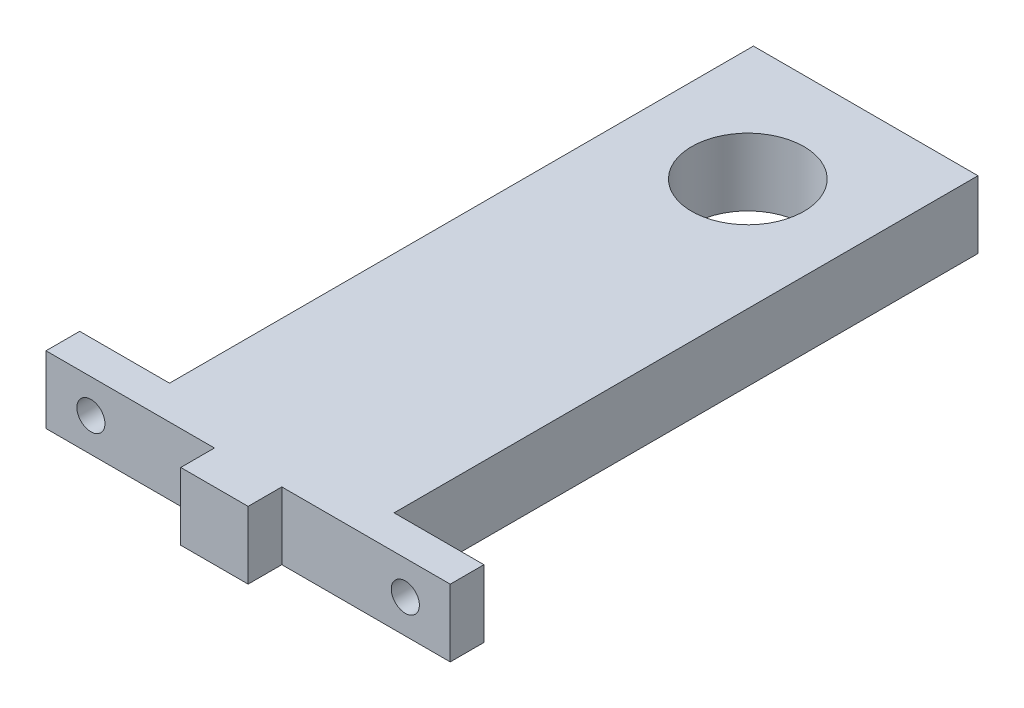
ISO-10303-21;
HEADER;
FILE_DESCRIPTION(('STEP AP214'),'2;1');
FILE_NAME('part.step','',(''),(''),'','','');
FILE_SCHEMA(('AUTOMOTIVE_DESIGN { 1 0 10303 214 1 1 1 1 }'));
ENDSEC;
DATA;
#1=APPLICATION_CONTEXT('core data for automotive mechanical design processes');
#2=APPLICATION_PROTOCOL_DEFINITION('international standard','automotive_design',2000,#1);
#3=PRODUCT_CONTEXT('',#1,'mechanical');
#4=PRODUCT('Part','Part','',(#3));
#5=PRODUCT_RELATED_PRODUCT_CATEGORY('part','',(#4));
#6=PRODUCT_DEFINITION_FORMATION('','',#4);
#7=PRODUCT_DEFINITION_CONTEXT('part definition',#1,'design');
#8=PRODUCT_DEFINITION('design','',#6,#7);
#9=PRODUCT_DEFINITION_SHAPE('','',#8);
#10=(LENGTH_UNIT() NAMED_UNIT(*) SI_UNIT(.MILLI.,.METRE.));
#11=(NAMED_UNIT(*) PLANE_ANGLE_UNIT() SI_UNIT($,.RADIAN.));
#12=(NAMED_UNIT(*) SI_UNIT($,.STERADIAN.) SOLID_ANGLE_UNIT());
#13=UNCERTAINTY_MEASURE_WITH_UNIT(LENGTH_MEASURE(1.E-05),#10,'distance_accuracy_value','');
#14=(GEOMETRIC_REPRESENTATION_CONTEXT(3) GLOBAL_UNCERTAINTY_ASSIGNED_CONTEXT((#13)) GLOBAL_UNIT_ASSIGNED_CONTEXT((#10,
#11,#12)) REPRESENTATION_CONTEXT('',''));
#15=CARTESIAN_POINT('',(0.,0.,0.));
#16=DIRECTION('',(0.,0.,1.));
#17=DIRECTION('',(1.,0.,0.));
#18=AXIS2_PLACEMENT_3D('',#15,#16,#17);
#19=CARTESIAN_POINT('',(10.,6.,-37.3687398107685));
#20=DIRECTION('',(-1.,0.,0.));
#21=DIRECTION('',(0.,0.,1.));
#22=AXIS2_PLACEMENT_3D('',#19,#20,#21);
#23=PLANE('',#22);
#24=DIRECTION('',(0.,0.,-1.));
#25=VECTOR('',#24,1.);
#26=CARTESIAN_POINT('',(10.,0.,-37.3687398107685));
#27=LINE('',#26,#25);
#28=CARTESIAN_POINT('',(10.,0.,14.6312601892315));
#29=VERTEX_POINT('',#28);
#30=CARTESIAN_POINT('',(10.,0.,-37.3687398107685));
#31=VERTEX_POINT('',#30);
#32=EDGE_CURVE('E160',#29,#31,#27,.T.);
#33=ORIENTED_EDGE('',*,*,#32,.T.);
#34=DIRECTION('',(0.,-1.,0.));
#35=VECTOR('',#34,1.);
#36=CARTESIAN_POINT('',(10.,6.,-37.3687398107685));
#37=LINE('',#36,#35);
#38=CARTESIAN_POINT('',(10.,6.,-37.3687398107685));
#39=VERTEX_POINT('',#38);
#40=EDGE_CURVE('E11',#39,#31,#37,.T.);
#41=ORIENTED_EDGE('',*,*,#40,.F.);
#42=DIRECTION('',(0.,0.,-1.));
#43=VECTOR('',#42,1.);
#44=CARTESIAN_POINT('',(10.,6.,-37.3687398107685));
#45=LINE('',#44,#43);
#46=CARTESIAN_POINT('',(10.,6.,14.6312601892315));
#47=VERTEX_POINT('',#46);
#48=EDGE_CURVE('E183',#47,#39,#45,.T.);
#49=ORIENTED_EDGE('',*,*,#48,.F.);
#50=DIRECTION('',(0.,-1.,0.));
#51=VECTOR('',#50,1.);
#52=CARTESIAN_POINT('',(10.,6.,14.6312601892315));
#53=LINE('',#52,#51);
#54=EDGE_CURVE('E156',#47,#29,#53,.T.);
#55=ORIENTED_EDGE('',*,*,#54,.T.);
#56=EDGE_LOOP('',(#33,#41,#49,#55));
#57=FACE_BOUND('',#56,.T.);
#58=ADVANCED_FACE('F38',(#57),#23,.F.);
#59=CARTESIAN_POINT('',(-10.,6.,-37.3687398107685));
#60=DIRECTION('',(0.,0.,1.));
#61=DIRECTION('',(1.,0.,0.));
#62=AXIS2_PLACEMENT_3D('',#59,#60,#61);
#63=PLANE('',#62);
#64=DIRECTION('',(-1.,0.,0.));
#65=VECTOR('',#64,1.);
#66=CARTESIAN_POINT('',(-10.,0.,-37.3687398107685));
#67=LINE('',#66,#65);
#68=CARTESIAN_POINT('',(-10.,0.,-37.3687398107685));
#69=VERTEX_POINT('',#68);
#70=EDGE_CURVE('E163',#31,#69,#67,.T.);
#71=ORIENTED_EDGE('',*,*,#70,.T.);
#72=DIRECTION('',(0.,-1.,0.));
#73=VECTOR('',#72,1.);
#74=CARTESIAN_POINT('',(-10.,6.,-37.3687398107685));
#75=LINE('',#74,#73);
#76=CARTESIAN_POINT('',(-10.,6.,-37.3687398107685));
#77=VERTEX_POINT('',#76);
#78=EDGE_CURVE('E47',#77,#69,#75,.T.);
#79=ORIENTED_EDGE('',*,*,#78,.F.);
#80=DIRECTION('',(-1.,0.,0.));
#81=VECTOR('',#80,1.);
#82=CARTESIAN_POINT('',(-10.,6.,-37.3687398107685));
#83=LINE('',#82,#81);
#84=EDGE_CURVE('E111',#39,#77,#83,.T.);
#85=ORIENTED_EDGE('',*,*,#84,.F.);
#86=ORIENTED_EDGE('',*,*,#40,.T.);
#87=EDGE_LOOP('',(#71,#79,#85,#86));
#88=FACE_BOUND('',#87,.T.);
#89=ADVANCED_FACE('F268',(#88),#63,.F.);
#90=CARTESIAN_POINT('',(-10.,6.,-37.3687398107685));
#91=DIRECTION('',(1.,0.,0.));
#92=DIRECTION('',(0.,0.,-1.));
#93=AXIS2_PLACEMENT_3D('',#90,#91,#92);
#94=PLANE('',#93);
#95=DIRECTION('',(0.,0.,1.));
#96=VECTOR('',#95,1.);
#97=CARTESIAN_POINT('',(-10.,0.,-37.3687398107685));
#98=LINE('',#97,#96);
#99=CARTESIAN_POINT('',(-10.,0.,14.6312601892315));
#100=VERTEX_POINT('',#99);
#101=EDGE_CURVE('E166',#69,#100,#98,.T.);
#102=ORIENTED_EDGE('',*,*,#101,.T.);
#103=DIRECTION('',(0.,-1.,0.));
#104=VECTOR('',#103,1.);
#105=CARTESIAN_POINT('',(-10.,6.,14.6312601892315));
#106=LINE('',#105,#104);
#107=CARTESIAN_POINT('',(-10.,6.,14.6312601892315));
#108=VERTEX_POINT('',#107);
#109=EDGE_CURVE('E202',#108,#100,#106,.T.);
#110=ORIENTED_EDGE('',*,*,#109,.F.);
#111=DIRECTION('',(0.,0.,1.));
#112=VECTOR('',#111,1.);
#113=CARTESIAN_POINT('',(-10.,6.,-37.3687398107685));
#114=LINE('',#113,#112);
#115=EDGE_CURVE('E227',#77,#108,#114,.T.);
#116=ORIENTED_EDGE('',*,*,#115,.F.);
#117=ORIENTED_EDGE('',*,*,#78,.T.);
#118=EDGE_LOOP('',(#102,#110,#116,#117));
#119=FACE_BOUND('',#118,.T.);
#120=ADVANCED_FACE('F272',(#119),#94,.F.);
#121=CARTESIAN_POINT('',(-10.,6.,14.6312601892315));
#122=DIRECTION('',(0.,0.,1.));
#123=DIRECTION('',(1.,0.,0.));
#124=AXIS2_PLACEMENT_3D('',#121,#122,#123);
#125=PLANE('',#124);
#126=CARTESIAN_POINT('',(-14.,3.,14.6312601892315));
#127=DIRECTION('',(0.,0.,1.));
#128=DIRECTION('',(1.,0.,0.));
#129=AXIS2_PLACEMENT_3D('',#126,#127,#128);
#130=CIRCLE('',#129,1.25);
#131=CARTESIAN_POINT('',(-12.75,3.,14.6312601892315));
#132=VERTEX_POINT('',#131);
#133=EDGE_CURVE('E208',#132,#132,#130,.T.);
#134=ORIENTED_EDGE('',*,*,#133,.T.);
#135=EDGE_LOOP('',(#134));
#136=FACE_BOUND('',#135,.T.);
#137=DIRECTION('',(-1.,0.,0.));
#138=VECTOR('',#137,1.);
#139=CARTESIAN_POINT('',(-10.,0.,14.6312601892315));
#140=LINE('',#139,#138);
#141=CARTESIAN_POINT('',(-18.,0.,14.6312601892315));
#142=VERTEX_POINT('',#141);
#143=EDGE_CURVE('E168',#100,#142,#140,.T.);
#144=ORIENTED_EDGE('',*,*,#143,.T.);
#145=DIRECTION('',(0.,-1.,0.));
#146=VECTOR('',#145,1.);
#147=CARTESIAN_POINT('',(-18.,6.,14.6312601892315));
#148=LINE('',#147,#146);
#149=CARTESIAN_POINT('',(-18.,6.,14.6312601892315));
#150=VERTEX_POINT('',#149);
#151=EDGE_CURVE('E199',#150,#142,#148,.T.);
#152=ORIENTED_EDGE('',*,*,#151,.F.);
#153=DIRECTION('',(-1.,0.,0.));
#154=VECTOR('',#153,1.);
#155=CARTESIAN_POINT('',(-10.,6.,14.6312601892315));
#156=LINE('',#155,#154);
#157=EDGE_CURVE('E229',#108,#150,#156,.T.);
#158=ORIENTED_EDGE('',*,*,#157,.F.);
#159=ORIENTED_EDGE('',*,*,#109,.T.);
#160=EDGE_LOOP('',(#144,#152,#158,#159));
#161=FACE_BOUND('',#160,.T.);
#162=ADVANCED_FACE('F276',(#136,#161),#125,.F.);
#163=CARTESIAN_POINT('',(-18.,6.,14.6312601892315));
#164=DIRECTION('',(1.,0.,0.));
#165=DIRECTION('',(0.,0.,-1.));
#166=AXIS2_PLACEMENT_3D('',#163,#164,#165);
#167=PLANE('',#166);
#168=DIRECTION('',(0.,0.,1.));
#169=VECTOR('',#168,1.);
#170=CARTESIAN_POINT('',(-18.,0.,14.6312601892315));
#171=LINE('',#170,#169);
#172=CARTESIAN_POINT('',(-18.,0.,17.6312601892315));
#173=VERTEX_POINT('',#172);
#174=EDGE_CURVE('E170',#142,#173,#171,.T.);
#175=ORIENTED_EDGE('',*,*,#174,.T.);
#176=DIRECTION('',(0.,-1.,0.));
#177=VECTOR('',#176,1.);
#178=CARTESIAN_POINT('',(-18.,6.,17.6312601892315));
#179=LINE('',#178,#177);
#180=CARTESIAN_POINT('',(-18.,6.,17.6312601892315));
#181=VERTEX_POINT('',#180);
#182=EDGE_CURVE('E196',#181,#173,#179,.T.);
#183=ORIENTED_EDGE('',*,*,#182,.F.);
#184=DIRECTION('',(0.,0.,1.));
#185=VECTOR('',#184,1.);
#186=CARTESIAN_POINT('',(-18.,6.,14.6312601892315));
#187=LINE('',#186,#185);
#188=EDGE_CURVE('E231',#150,#181,#187,.T.);
#189=ORIENTED_EDGE('',*,*,#188,.F.);
#190=ORIENTED_EDGE('',*,*,#151,.T.);
#191=EDGE_LOOP('',(#175,#183,#189,#190));
#192=FACE_BOUND('',#191,.T.);
#193=ADVANCED_FACE('F282',(#192),#167,.F.);
#194=CARTESIAN_POINT('',(-18.,6.,17.6312601892315));
#195=DIRECTION('',(0.,0.,-1.));
#196=DIRECTION('',(-1.,0.,0.));
#197=AXIS2_PLACEMENT_3D('',#194,#195,#196);
#198=PLANE('',#197);
#199=CARTESIAN_POINT('',(-14.,3.,17.6312601892315));
#200=DIRECTION('',(0.,0.,-1.));
#201=DIRECTION('',(-1.,0.,0.));
#202=AXIS2_PLACEMENT_3D('',#199,#200,#201);
#203=CIRCLE('',#202,1.25);
#204=CARTESIAN_POINT('',(-15.25,3.,17.6312601892315));
#205=VERTEX_POINT('',#204);
#206=EDGE_CURVE('E206',#205,#205,#203,.T.);
#207=ORIENTED_EDGE('',*,*,#206,.T.);
#208=EDGE_LOOP('',(#207));
#209=FACE_BOUND('',#208,.T.);
#210=DIRECTION('',(1.,0.,0.));
#211=VECTOR('',#210,1.);
#212=CARTESIAN_POINT('',(-18.,0.,17.6312601892315));
#213=LINE('',#212,#211);
#214=CARTESIAN_POINT('',(-2.99999999999999,0.,17.6312601892315));
#215=VERTEX_POINT('',#214);
#216=EDGE_CURVE('E172',#173,#215,#213,.T.);
#217=ORIENTED_EDGE('',*,*,#216,.T.);
#218=DIRECTION('',(0.,-1.,0.));
#219=VECTOR('',#218,1.);
#220=CARTESIAN_POINT('',(-2.99999999999999,6.,17.6312601892315));
#221=LINE('',#220,#219);
#222=CARTESIAN_POINT('',(-2.99999999999999,6.,17.6312601892315));
#223=VERTEX_POINT('',#222);
#224=EDGE_CURVE('E193',#223,#215,#221,.T.);
#225=ORIENTED_EDGE('',*,*,#224,.F.);
#226=DIRECTION('',(1.,0.,0.));
#227=VECTOR('',#226,1.);
#228=CARTESIAN_POINT('',(-18.,6.,17.6312601892315));
#229=LINE('',#228,#227);
#230=EDGE_CURVE('E233',#181,#223,#229,.T.);
#231=ORIENTED_EDGE('',*,*,#230,.F.);
#232=ORIENTED_EDGE('',*,*,#182,.T.);
#233=EDGE_LOOP('',(#217,#225,#231,#232));
#234=FACE_BOUND('',#233,.T.);
#235=ADVANCED_FACE('F286',(#209,#234),#198,.F.);
#236=CARTESIAN_POINT('',(-2.99999999999999,6.,17.6312601892315));
#237=DIRECTION('',(1.,0.,0.));
#238=DIRECTION('',(0.,0.,-1.));
#239=AXIS2_PLACEMENT_3D('',#236,#237,#238);
#240=PLANE('',#239);
#241=DIRECTION('',(0.,0.,1.));
#242=VECTOR('',#241,1.);
#243=CARTESIAN_POINT('',(-2.99999999999999,0.,17.6312601892315));
#244=LINE('',#243,#242);
#245=CARTESIAN_POINT('',(-2.99999999999999,0.,20.6312601892315));
#246=VERTEX_POINT('',#245);
#247=EDGE_CURVE('E174',#215,#246,#244,.T.);
#248=ORIENTED_EDGE('',*,*,#247,.T.);
#249=DIRECTION('',(0.,-1.,0.));
#250=VECTOR('',#249,1.);
#251=CARTESIAN_POINT('',(-2.99999999999999,6.,20.6312601892315));
#252=LINE('',#251,#250);
#253=CARTESIAN_POINT('',(-2.99999999999999,6.,20.6312601892315));
#254=VERTEX_POINT('',#253);
#255=EDGE_CURVE('E190',#254,#246,#252,.T.);
#256=ORIENTED_EDGE('',*,*,#255,.F.);
#257=DIRECTION('',(0.,0.,1.));
#258=VECTOR('',#257,1.);
#259=CARTESIAN_POINT('',(-2.99999999999999,6.,17.6312601892315));
#260=LINE('',#259,#258);
#261=EDGE_CURVE('E235',#223,#254,#260,.T.);
#262=ORIENTED_EDGE('',*,*,#261,.F.);
#263=ORIENTED_EDGE('',*,*,#224,.T.);
#264=EDGE_LOOP('',(#248,#256,#262,#263));
#265=FACE_BOUND('',#264,.T.);
#266=ADVANCED_FACE('F290',(#265),#240,.F.);
#267=CARTESIAN_POINT('',(3.00000000000001,6.,20.6312601892315));
#268=DIRECTION('',(0.,0.,-1.));
#269=DIRECTION('',(-1.,0.,0.));
#270=AXIS2_PLACEMENT_3D('',#267,#268,#269);
#271=PLANE('',#270);
#272=DIRECTION('',(1.,0.,0.));
#273=VECTOR('',#272,1.);
#274=CARTESIAN_POINT('',(3.00000000000001,0.,20.6312601892315));
#275=LINE('',#274,#273);
#276=CARTESIAN_POINT('',(3.00000000000001,0.,20.6312601892315));
#277=VERTEX_POINT('',#276);
#278=EDGE_CURVE('E176',#246,#277,#275,.T.);
#279=ORIENTED_EDGE('',*,*,#278,.T.);
#280=DIRECTION('',(0.,-1.,0.));
#281=VECTOR('',#280,1.);
#282=CARTESIAN_POINT('',(3.00000000000001,6.,20.6312601892315));
#283=LINE('',#282,#281);
#284=CARTESIAN_POINT('',(3.00000000000001,6.,20.6312601892315));
#285=VERTEX_POINT('',#284);
#286=EDGE_CURVE('E187',#285,#277,#283,.T.);
#287=ORIENTED_EDGE('',*,*,#286,.F.);
#288=DIRECTION('',(1.,0.,0.));
#289=VECTOR('',#288,1.);
#290=CARTESIAN_POINT('',(3.00000000000001,6.,20.6312601892315));
#291=LINE('',#290,#289);
#292=EDGE_CURVE('E237',#254,#285,#291,.T.);
#293=ORIENTED_EDGE('',*,*,#292,.F.);
#294=ORIENTED_EDGE('',*,*,#255,.T.);
#295=EDGE_LOOP('',(#279,#287,#293,#294));
#296=FACE_BOUND('',#295,.T.);
#297=ADVANCED_FACE('F243',(#296),#271,.F.);
#298=CARTESIAN_POINT('',(3.,6.,17.6312601892315));
#299=DIRECTION('',(-1.,0.,0.));
#300=DIRECTION('',(0.,0.,1.));
#301=AXIS2_PLACEMENT_3D('',#298,#299,#300);
#302=PLANE('',#301);
#303=DIRECTION('',(0.,0.,-1.));
#304=VECTOR('',#303,1.);
#305=CARTESIAN_POINT('',(3.,0.,17.6312601892315));
#306=LINE('',#305,#304);
#307=CARTESIAN_POINT('',(3.,0.,17.6312601892315));
#308=VERTEX_POINT('',#307);
#309=EDGE_CURVE('E178',#277,#308,#306,.T.);
#310=ORIENTED_EDGE('',*,*,#309,.T.);
#311=DIRECTION('',(0.,-1.,0.));
#312=VECTOR('',#311,1.);
#313=CARTESIAN_POINT('',(3.,6.,17.6312601892315));
#314=LINE('',#313,#312);
#315=CARTESIAN_POINT('',(3.,6.,17.6312601892315));
#316=VERTEX_POINT('',#315);
#317=EDGE_CURVE('E151',#316,#308,#314,.T.);
#318=ORIENTED_EDGE('',*,*,#317,.F.);
#319=DIRECTION('',(0.,0.,-1.));
#320=VECTOR('',#319,1.);
#321=CARTESIAN_POINT('',(3.,6.,17.6312601892315));
#322=LINE('',#321,#320);
#323=EDGE_CURVE('E142',#285,#316,#322,.T.);
#324=ORIENTED_EDGE('',*,*,#323,.F.);
#325=ORIENTED_EDGE('',*,*,#286,.T.);
#326=EDGE_LOOP('',(#310,#318,#324,#325));
#327=FACE_BOUND('',#326,.T.);
#328=ADVANCED_FACE('F247',(#327),#302,.F.);
#329=CARTESIAN_POINT('',(18.,6.,17.6312601892315));
#330=DIRECTION('',(0.,0.,-1.));
#331=DIRECTION('',(-1.,0.,0.));
#332=AXIS2_PLACEMENT_3D('',#329,#330,#331);
#333=PLANE('',#332);
#334=CARTESIAN_POINT('',(14.,3.,17.6312601892315));
#335=DIRECTION('',(0.,0.,-1.));
#336=DIRECTION('',(-1.,0.,0.));
#337=AXIS2_PLACEMENT_3D('',#334,#335,#336);
#338=CIRCLE('',#337,1.25);
#339=CARTESIAN_POINT('',(12.75,3.,17.6312601892315));
#340=VERTEX_POINT('',#339);
#341=EDGE_CURVE('E209',#340,#340,#338,.T.);
#342=ORIENTED_EDGE('',*,*,#341,.T.);
#343=EDGE_LOOP('',(#342));
#344=FACE_BOUND('',#343,.T.);
#345=DIRECTION('',(1.,0.,0.));
#346=VECTOR('',#345,1.);
#347=CARTESIAN_POINT('',(18.,0.,17.6312601892315));
#348=LINE('',#347,#346);
#349=CARTESIAN_POINT('',(18.,0.,17.6312601892315));
#350=VERTEX_POINT('',#349);
#351=EDGE_CURVE('E150',#308,#350,#348,.T.);
#352=ORIENTED_EDGE('',*,*,#351,.T.);
#353=DIRECTION('',(0.,-1.,0.));
#354=VECTOR('',#353,1.);
#355=CARTESIAN_POINT('',(18.,6.,17.6312601892315));
#356=LINE('',#355,#354);
#357=CARTESIAN_POINT('',(18.,6.,17.6312601892315));
#358=VERTEX_POINT('',#357);
#359=EDGE_CURVE('E147',#358,#350,#356,.T.);
#360=ORIENTED_EDGE('',*,*,#359,.F.);
#361=DIRECTION('',(1.,0.,0.));
#362=VECTOR('',#361,1.);
#363=CARTESIAN_POINT('',(18.,6.,17.6312601892315));
#364=LINE('',#363,#362);
#365=EDGE_CURVE('E136',#316,#358,#364,.T.);
#366=ORIENTED_EDGE('',*,*,#365,.F.);
#367=ORIENTED_EDGE('',*,*,#317,.T.);
#368=EDGE_LOOP('',(#352,#360,#366,#367));
#369=FACE_BOUND('',#368,.T.);
#370=ADVANCED_FACE('F148',(#344,#369),#333,.F.);
#371=CARTESIAN_POINT('',(18.,6.,14.6312601892315));
#372=DIRECTION('',(-1.,0.,0.));
#373=DIRECTION('',(0.,0.,1.));
#374=AXIS2_PLACEMENT_3D('',#371,#372,#373);
#375=PLANE('',#374);
#376=DIRECTION('',(0.,0.,-1.));
#377=VECTOR('',#376,1.);
#378=CARTESIAN_POINT('',(18.,0.,14.6312601892315));
#379=LINE('',#378,#377);
#380=CARTESIAN_POINT('',(18.,0.,14.6312601892315));
#381=VERTEX_POINT('',#380);
#382=EDGE_CURVE('E97',#350,#381,#379,.T.);
#383=ORIENTED_EDGE('',*,*,#382,.T.);
#384=DIRECTION('',(0.,-1.,0.));
#385=VECTOR('',#384,1.);
#386=CARTESIAN_POINT('',(18.,6.,14.6312601892315));
#387=LINE('',#386,#385);
#388=CARTESIAN_POINT('',(18.,6.,14.6312601892315));
#389=VERTEX_POINT('',#388);
#390=EDGE_CURVE('E152',#389,#381,#387,.T.);
#391=ORIENTED_EDGE('',*,*,#390,.F.);
#392=DIRECTION('',(0.,0.,-1.));
#393=VECTOR('',#392,1.);
#394=CARTESIAN_POINT('',(18.,6.,14.6312601892315));
#395=LINE('',#394,#393);
#396=EDGE_CURVE('E140',#358,#389,#395,.T.);
#397=ORIENTED_EDGE('',*,*,#396,.F.);
#398=ORIENTED_EDGE('',*,*,#359,.T.);
#399=EDGE_LOOP('',(#383,#391,#397,#398));
#400=FACE_BOUND('',#399,.T.);
#401=ADVANCED_FACE('F154',(#400),#375,.F.);
#402=CARTESIAN_POINT('',(10.,6.,14.6312601892315));
#403=DIRECTION('',(0.,0.,1.));
#404=DIRECTION('',(1.,0.,0.));
#405=AXIS2_PLACEMENT_3D('',#402,#403,#404);
#406=PLANE('',#405);
#407=CARTESIAN_POINT('',(14.,3.,14.6312601892315));
#408=DIRECTION('',(0.,0.,1.));
#409=DIRECTION('',(1.,0.,0.));
#410=AXIS2_PLACEMENT_3D('',#407,#408,#409);
#411=CIRCLE('',#410,1.25);
#412=CARTESIAN_POINT('',(15.25,3.,14.6312601892315));
#413=VERTEX_POINT('',#412);
#414=EDGE_CURVE('E41',#413,#413,#411,.T.);
#415=ORIENTED_EDGE('',*,*,#414,.T.);
#416=EDGE_LOOP('',(#415));
#417=FACE_BOUND('',#416,.T.);
#418=DIRECTION('',(-1.,0.,0.));
#419=VECTOR('',#418,1.);
#420=CARTESIAN_POINT('',(10.,0.,14.6312601892315));
#421=LINE('',#420,#419);
#422=EDGE_CURVE('E103',#381,#29,#421,.T.);
#423=ORIENTED_EDGE('',*,*,#422,.T.);
#424=ORIENTED_EDGE('',*,*,#54,.F.);
#425=DIRECTION('',(-1.,0.,0.));
#426=VECTOR('',#425,1.);
#427=CARTESIAN_POINT('',(10.,6.,14.6312601892315));
#428=LINE('',#427,#426);
#429=EDGE_CURVE('E56',#389,#47,#428,.T.);
#430=ORIENTED_EDGE('',*,*,#429,.F.);
#431=ORIENTED_EDGE('',*,*,#390,.T.);
#432=EDGE_LOOP('',(#423,#424,#430,#431));
#433=FACE_BOUND('',#432,.T.);
#434=ADVANCED_FACE('F255',(#417,#433),#406,.F.);
#435=CARTESIAN_POINT('',(0.,6.,0.));
#436=DIRECTION('',(0.,1.,0.));
#437=DIRECTION('',(0.,0.,1.));
#438=AXIS2_PLACEMENT_3D('',#435,#436,#437);
#439=PLANE('',#438);
#440=CARTESIAN_POINT('',(0.,6.,-26.8687398107685));
#441=DIRECTION('',(0.,-1.,0.));
#442=DIRECTION('',(0.,0.,-1.));
#443=AXIS2_PLACEMENT_3D('',#440,#441,#442);
#444=CIRCLE('',#443,5.);
#445=CARTESIAN_POINT('',(0.,6.,-31.8687398107685));
#446=VERTEX_POINT('',#445);
#447=EDGE_CURVE('E164',#446,#446,#444,.T.);
#448=ORIENTED_EDGE('',*,*,#447,.T.);
#449=EDGE_LOOP('',(#448));
#450=FACE_BOUND('',#449,.T.);
#451=ORIENTED_EDGE('',*,*,#48,.T.);
#452=ORIENTED_EDGE('',*,*,#84,.T.);
#453=ORIENTED_EDGE('',*,*,#115,.T.);
#454=ORIENTED_EDGE('',*,*,#157,.T.);
#455=ORIENTED_EDGE('',*,*,#188,.T.);
#456=ORIENTED_EDGE('',*,*,#230,.T.);
#457=ORIENTED_EDGE('',*,*,#261,.T.);
#458=ORIENTED_EDGE('',*,*,#292,.T.);
#459=ORIENTED_EDGE('',*,*,#323,.T.);
#460=ORIENTED_EDGE('',*,*,#365,.T.);
#461=ORIENTED_EDGE('',*,*,#396,.T.);
#462=ORIENTED_EDGE('',*,*,#429,.T.);
#463=EDGE_LOOP('',(#451,#452,#453,#454,#455,#456,#457,#458,#459,#460,#461,#462));
#464=FACE_BOUND('',#463,.T.);
#465=ADVANCED_FACE('F138',(#450,#464),#439,.T.);
#466=CARTESIAN_POINT('',(0.,0.,0.));
#467=DIRECTION('',(0.,1.,0.));
#468=DIRECTION('',(0.,0.,1.));
#469=AXIS2_PLACEMENT_3D('',#466,#467,#468);
#470=PLANE('',#469);
#471=CARTESIAN_POINT('',(0.,0.,-26.8687398107685));
#472=DIRECTION('',(0.,-1.,0.));
#473=DIRECTION('',(0.,0.,-1.));
#474=AXIS2_PLACEMENT_3D('',#471,#472,#473);
#475=CIRCLE('',#474,5.);
#476=CARTESIAN_POINT('',(0.,0.,-31.8687398107685));
#477=VERTEX_POINT('',#476);
#478=EDGE_CURVE('E213',#477,#477,#475,.T.);
#479=ORIENTED_EDGE('',*,*,#478,.F.);
#480=EDGE_LOOP('',(#479));
#481=FACE_BOUND('',#480,.T.);
#482=ORIENTED_EDGE('',*,*,#32,.F.);
#483=ORIENTED_EDGE('',*,*,#422,.F.);
#484=ORIENTED_EDGE('',*,*,#382,.F.);
#485=ORIENTED_EDGE('',*,*,#351,.F.);
#486=ORIENTED_EDGE('',*,*,#309,.F.);
#487=ORIENTED_EDGE('',*,*,#278,.F.);
#488=ORIENTED_EDGE('',*,*,#247,.F.);
#489=ORIENTED_EDGE('',*,*,#216,.F.);
#490=ORIENTED_EDGE('',*,*,#174,.F.);
#491=ORIENTED_EDGE('',*,*,#143,.F.);
#492=ORIENTED_EDGE('',*,*,#101,.F.);
#493=ORIENTED_EDGE('',*,*,#70,.F.);
#494=EDGE_LOOP('',(#482,#483,#484,#485,#486,#487,#488,#489,#490,#491,#492,#493));
#495=FACE_BOUND('',#494,.T.);
#496=ADVANCED_FACE('F250',(#481,#495),#470,.F.);
#497=CARTESIAN_POINT('',(0.,6.,-26.8687398107685));
#498=DIRECTION('',(0.,-1.,0.));
#499=DIRECTION('',(0.,0.,-1.));
#500=AXIS2_PLACEMENT_3D('',#497,#498,#499);
#501=CYLINDRICAL_SURFACE('',#500,5.);
#502=ORIENTED_EDGE('',*,*,#447,.F.);
#503=EDGE_LOOP('',(#502));
#504=FACE_BOUND('',#503,.T.);
#505=ORIENTED_EDGE('',*,*,#478,.T.);
#506=EDGE_LOOP('',(#505));
#507=FACE_BOUND('',#506,.T.);
#508=ADVANCED_FACE('F327',(#504,#507),#501,.F.);
#509=CARTESIAN_POINT('',(-14.,3.,-37.3687398107685));
#510=DIRECTION('',(0.,0.,1.));
#511=DIRECTION('',(1.,0.,0.));
#512=AXIS2_PLACEMENT_3D('',#509,#510,#511);
#513=CYLINDRICAL_SURFACE('',#512,1.25);
#514=ORIENTED_EDGE('',*,*,#206,.F.);
#515=EDGE_LOOP('',(#514));
#516=FACE_BOUND('',#515,.T.);
#517=ORIENTED_EDGE('',*,*,#133,.F.);
#518=EDGE_LOOP('',(#517));
#519=FACE_BOUND('',#518,.T.);
#520=ADVANCED_FACE('F336',(#516,#519),#513,.F.);
#521=CARTESIAN_POINT('',(14.,3.,-37.3687398107685));
#522=DIRECTION('',(0.,0.,1.));
#523=DIRECTION('',(1.,0.,0.));
#524=AXIS2_PLACEMENT_3D('',#521,#522,#523);
#525=CYLINDRICAL_SURFACE('',#524,1.25);
#526=ORIENTED_EDGE('',*,*,#414,.F.);
#527=EDGE_LOOP('',(#526));
#528=FACE_BOUND('',#527,.T.);
#529=ORIENTED_EDGE('',*,*,#341,.F.);
#530=EDGE_LOOP('',(#529));
#531=FACE_BOUND('',#530,.T.);
#532=ADVANCED_FACE('F392',(#528,#531),#525,.F.);
#533=CLOSED_SHELL('',(#58,#89,#120,#162,#193,#235,#266,#297,#328,#370,#401,#434,#465,#496,#508,
#520,#532));
#534=MANIFOLD_SOLID_BREP('B2',#533);
#535=ADVANCED_BREP_SHAPE_REPRESENTATION('',(#18,#534),#14);
#536=SHAPE_DEFINITION_REPRESENTATION(#9,#535);
ENDSEC;
END-ISO-10303-21;
